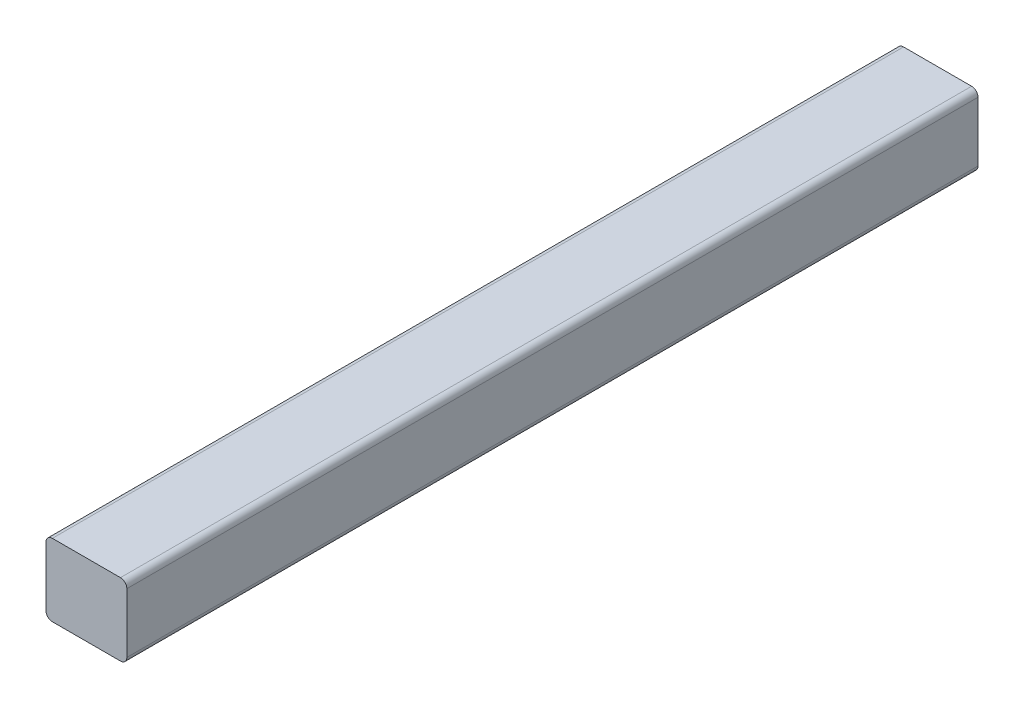
ISO-10303-21;
HEADER;
FILE_DESCRIPTION(('STEP AP214'),'2;1');
FILE_NAME('part.step','',(''),(''),'','','');
FILE_SCHEMA(('AUTOMOTIVE_DESIGN { 1 0 10303 214 1 1 1 1 }'));
ENDSEC;
DATA;
#1=APPLICATION_CONTEXT('core data for automotive mechanical design processes');
#2=APPLICATION_PROTOCOL_DEFINITION('international standard','automotive_design',2000,#1);
#3=PRODUCT_CONTEXT('',#1,'mechanical');
#4=PRODUCT('Part','Part','',(#3));
#5=PRODUCT_RELATED_PRODUCT_CATEGORY('part','',(#4));
#6=PRODUCT_DEFINITION_FORMATION('','',#4);
#7=PRODUCT_DEFINITION_CONTEXT('part definition',#1,'design');
#8=PRODUCT_DEFINITION('design','',#6,#7);
#9=PRODUCT_DEFINITION_SHAPE('','',#8);
#10=(LENGTH_UNIT() NAMED_UNIT(*) SI_UNIT(.MILLI.,.METRE.));
#11=(NAMED_UNIT(*) PLANE_ANGLE_UNIT() SI_UNIT($,.RADIAN.));
#12=(NAMED_UNIT(*) SI_UNIT($,.STERADIAN.) SOLID_ANGLE_UNIT());
#13=UNCERTAINTY_MEASURE_WITH_UNIT(LENGTH_MEASURE(1.E-05),#10,'distance_accuracy_value','');
#14=(GEOMETRIC_REPRESENTATION_CONTEXT(3) GLOBAL_UNCERTAINTY_ASSIGNED_CONTEXT((#13)) GLOBAL_UNIT_ASSIGNED_CONTEXT((#10,
#11,#12)) REPRESENTATION_CONTEXT('',''));
#15=CARTESIAN_POINT('',(0.,0.,0.));
#16=DIRECTION('',(0.,0.,1.));
#17=DIRECTION('',(1.,0.,0.));
#18=AXIS2_PLACEMENT_3D('',#15,#16,#17);
#19=CARTESIAN_POINT('',(-3.99999999999997,27.9897948556636,100.));
#20=DIRECTION('',(0.,0.,-1.));
#21=DIRECTION('',(-1.,0.,0.));
#22=AXIS2_PLACEMENT_3D('',#19,#20,#21);
#23=CYLINDRICAL_SURFACE('',#22,0.750000000000013);
#24=CARTESIAN_POINT('',(-3.99999999999997,27.9897948556636,0.));
#25=DIRECTION('',(0.,0.,1.));
#26=DIRECTION('',(1.,0.,0.));
#27=AXIS2_PLACEMENT_3D('',#24,#25,#26);
#28=CIRCLE('',#27,0.750000000000013);
#29=CARTESIAN_POINT('',(-4.74999999999999,27.9897948556636,0.));
#30=VERTEX_POINT('',#29);
#31=CARTESIAN_POINT('',(-3.99999999999994,28.7397948556636,0.));
#32=VERTEX_POINT('',#31);
#33=EDGE_CURVE('E133',#30,#32,#28,.F.);
#34=ORIENTED_EDGE('',*,*,#33,.F.);
#35=DIRECTION('',(0.,0.,-1.));
#36=VECTOR('',#35,1.);
#37=CARTESIAN_POINT('',(-4.74999999999999,27.9897948556636,100.));
#38=LINE('',#37,#36);
#39=CARTESIAN_POINT('',(-4.74999999999999,27.9897948556636,100.));
#40=VERTEX_POINT('',#39);
#41=EDGE_CURVE('E11',#40,#30,#38,.T.);
#42=ORIENTED_EDGE('',*,*,#41,.F.);
#43=CARTESIAN_POINT('',(-3.99999999999997,27.9897948556636,100.));
#44=DIRECTION('',(0.,0.,1.));
#45=DIRECTION('',(1.,0.,0.));
#46=AXIS2_PLACEMENT_3D('',#43,#44,#45);
#47=CIRCLE('',#46,0.750000000000013);
#48=CARTESIAN_POINT('',(-3.99999999999994,28.7397948556636,100.));
#49=VERTEX_POINT('',#48);
#50=EDGE_CURVE('E152',#40,#49,#47,.F.);
#51=ORIENTED_EDGE('',*,*,#50,.T.);
#52=DIRECTION('',(0.,0.,-1.));
#53=VECTOR('',#52,1.);
#54=CARTESIAN_POINT('',(-3.99999999999994,28.7397948556636,100.));
#55=LINE('',#54,#53);
#56=EDGE_CURVE('E55',#49,#32,#55,.T.);
#57=ORIENTED_EDGE('',*,*,#56,.T.);
#58=EDGE_LOOP('',(#34,#42,#51,#57));
#59=FACE_BOUND('',#58,.T.);
#60=ADVANCED_FACE('F39',(#59),#23,.T.);
#61=CARTESIAN_POINT('',(-4.75000000000004,0.,100.));
#62=DIRECTION('',(-1.,0.,0.));
#63=DIRECTION('',(0.,-1.,0.));
#64=AXIS2_PLACEMENT_3D('',#61,#62,#63);
#65=PLANE('',#64);
#66=DIRECTION('',(0.,1.,0.));
#67=VECTOR('',#66,1.);
#68=CARTESIAN_POINT('',(-4.75000000000004,0.,0.));
#69=LINE('',#68,#67);
#70=CARTESIAN_POINT('',(-4.75,21.,0.));
#71=VERTEX_POINT('',#70);
#72=EDGE_CURVE('E135',#71,#30,#69,.T.);
#73=ORIENTED_EDGE('',*,*,#72,.F.);
#74=DIRECTION('',(0.,0.,-1.));
#75=VECTOR('',#74,1.);
#76=CARTESIAN_POINT('',(-4.75,21.,100.));
#77=LINE('',#76,#75);
#78=CARTESIAN_POINT('',(-4.75,21.,100.));
#79=VERTEX_POINT('',#78);
#80=EDGE_CURVE('E47',#79,#71,#77,.T.);
#81=ORIENTED_EDGE('',*,*,#80,.F.);
#82=DIRECTION('',(0.,1.,0.));
#83=VECTOR('',#82,1.);
#84=CARTESIAN_POINT('',(-4.75000000000004,0.,100.));
#85=LINE('',#84,#83);
#86=EDGE_CURVE('E174',#79,#40,#85,.T.);
#87=ORIENTED_EDGE('',*,*,#86,.T.);
#88=ORIENTED_EDGE('',*,*,#41,.T.);
#89=EDGE_LOOP('',(#73,#81,#87,#88));
#90=FACE_BOUND('',#89,.T.);
#91=ADVANCED_FACE('F173',(#90),#65,.T.);
#92=CARTESIAN_POINT('',(-3.99999999999999,21.,100.));
#93=DIRECTION('',(0.,0.,-1.));
#94=DIRECTION('',(-1.,0.,0.));
#95=AXIS2_PLACEMENT_3D('',#92,#93,#94);
#96=CYLINDRICAL_SURFACE('',#95,0.750000000000013);
#97=CARTESIAN_POINT('',(-3.99999999999999,21.,0.));
#98=DIRECTION('',(0.,0.,1.));
#99=DIRECTION('',(1.,0.,0.));
#100=AXIS2_PLACEMENT_3D('',#97,#98,#99);
#101=CIRCLE('',#100,0.750000000000013);
#102=CARTESIAN_POINT('',(-3.99999999999996,20.25,0.));
#103=VERTEX_POINT('',#102);
#104=EDGE_CURVE('E138',#71,#103,#101,.T.);
#105=ORIENTED_EDGE('',*,*,#104,.T.);
#106=DIRECTION('',(0.,0.,-1.));
#107=VECTOR('',#106,1.);
#108=CARTESIAN_POINT('',(-3.99999999999996,20.25,100.));
#109=LINE('',#108,#107);
#110=CARTESIAN_POINT('',(-3.99999999999996,20.25,100.));
#111=VERTEX_POINT('',#110);
#112=EDGE_CURVE('E158',#111,#103,#109,.T.);
#113=ORIENTED_EDGE('',*,*,#112,.F.);
#114=CARTESIAN_POINT('',(-3.99999999999999,21.,100.));
#115=DIRECTION('',(0.,0.,1.));
#116=DIRECTION('',(1.,0.,0.));
#117=AXIS2_PLACEMENT_3D('',#114,#115,#116);
#118=CIRCLE('',#117,0.750000000000013);
#119=EDGE_CURVE('E164',#79,#111,#118,.T.);
#120=ORIENTED_EDGE('',*,*,#119,.F.);
#121=ORIENTED_EDGE('',*,*,#80,.T.);
#122=EDGE_LOOP('',(#105,#113,#120,#121));
#123=FACE_BOUND('',#122,.T.);
#124=ADVANCED_FACE('F162',(#123),#96,.T.);
#125=CARTESIAN_POINT('',(1.59833084267812E-12,20.2499999999997,100.));
#126=DIRECTION('',(0.,-1.,0.));
#127=DIRECTION('',(1.,0.,0.));
#128=AXIS2_PLACEMENT_3D('',#125,#126,#127);
#129=PLANE('',#128);
#130=DIRECTION('',(-1.,0.,0.));
#131=VECTOR('',#130,1.);
#132=CARTESIAN_POINT('',(1.59833084267812E-12,20.2499999999997,0.));
#133=LINE('',#132,#131);
#134=CARTESIAN_POINT('',(4.00000000000001,20.25,0.));
#135=VERTEX_POINT('',#134);
#136=EDGE_CURVE('E141',#135,#103,#133,.T.);
#137=ORIENTED_EDGE('',*,*,#136,.F.);
#138=DIRECTION('',(0.,0.,-1.));
#139=VECTOR('',#138,1.);
#140=CARTESIAN_POINT('',(4.00000000000001,20.25,100.));
#141=LINE('',#140,#139);
#142=CARTESIAN_POINT('',(4.00000000000001,20.25,100.));
#143=VERTEX_POINT('',#142);
#144=EDGE_CURVE('E156',#143,#135,#141,.T.);
#145=ORIENTED_EDGE('',*,*,#144,.F.);
#146=DIRECTION('',(-1.,0.,0.));
#147=VECTOR('',#146,1.);
#148=CARTESIAN_POINT('',(1.59833084267812E-12,20.2499999999997,100.));
#149=LINE('',#148,#147);
#150=EDGE_CURVE('E265',#143,#111,#149,.T.);
#151=ORIENTED_EDGE('',*,*,#150,.T.);
#152=ORIENTED_EDGE('',*,*,#112,.T.);
#153=EDGE_LOOP('',(#137,#145,#151,#152));
#154=FACE_BOUND('',#153,.T.);
#155=ADVANCED_FACE('F192',(#154),#129,.T.);
#156=CARTESIAN_POINT('',(4.00000000000001,21.,100.));
#157=DIRECTION('',(0.,0.,-1.));
#158=DIRECTION('',(-1.,0.,0.));
#159=AXIS2_PLACEMENT_3D('',#156,#157,#158);
#160=CYLINDRICAL_SURFACE('',#159,0.750000000000015);
#161=CARTESIAN_POINT('',(4.00000000000001,21.,0.));
#162=DIRECTION('',(0.,0.,1.));
#163=DIRECTION('',(1.,0.,0.));
#164=AXIS2_PLACEMENT_3D('',#161,#162,#163);
#165=CIRCLE('',#164,0.750000000000015);
#166=CARTESIAN_POINT('',(4.75000000000004,21.,0.));
#167=VERTEX_POINT('',#166);
#168=EDGE_CURVE('E144',#135,#167,#165,.T.);
#169=ORIENTED_EDGE('',*,*,#168,.T.);
#170=DIRECTION('',(0.,0.,-1.));
#171=VECTOR('',#170,1.);
#172=CARTESIAN_POINT('',(4.75000000000004,21.,100.));
#173=LINE('',#172,#171);
#174=CARTESIAN_POINT('',(4.75000000000004,21.,100.));
#175=VERTEX_POINT('',#174);
#176=EDGE_CURVE('E125',#175,#167,#173,.T.);
#177=ORIENTED_EDGE('',*,*,#176,.F.);
#178=CARTESIAN_POINT('',(4.00000000000001,21.,100.));
#179=DIRECTION('',(0.,0.,1.));
#180=DIRECTION('',(1.,0.,0.));
#181=AXIS2_PLACEMENT_3D('',#178,#179,#180);
#182=CIRCLE('',#181,0.750000000000015);
#183=EDGE_CURVE('E113',#143,#175,#182,.T.);
#184=ORIENTED_EDGE('',*,*,#183,.F.);
#185=ORIENTED_EDGE('',*,*,#144,.T.);
#186=EDGE_LOOP('',(#169,#177,#184,#185));
#187=FACE_BOUND('',#186,.T.);
#188=ADVANCED_FACE('F197',(#187),#160,.T.);
#189=CARTESIAN_POINT('',(4.75,0.,100.));
#190=DIRECTION('',(-1.,0.,0.));
#191=DIRECTION('',(0.,-1.,0.));
#192=AXIS2_PLACEMENT_3D('',#189,#190,#191);
#193=PLANE('',#192);
#194=DIRECTION('',(0.,1.,0.));
#195=VECTOR('',#194,1.);
#196=CARTESIAN_POINT('',(4.75,0.,0.));
#197=LINE('',#196,#195);
#198=CARTESIAN_POINT('',(4.75000000000006,27.9897948556636,0.));
#199=VERTEX_POINT('',#198);
#200=EDGE_CURVE('E122',#167,#199,#197,.T.);
#201=ORIENTED_EDGE('',*,*,#200,.T.);
#202=DIRECTION('',(0.,0.,-1.));
#203=VECTOR('',#202,1.);
#204=CARTESIAN_POINT('',(4.75000000000006,27.9897948556636,100.));
#205=LINE('',#204,#203);
#206=CARTESIAN_POINT('',(4.75000000000006,27.9897948556636,100.));
#207=VERTEX_POINT('',#206);
#208=EDGE_CURVE('E119',#207,#199,#205,.T.);
#209=ORIENTED_EDGE('',*,*,#208,.F.);
#210=DIRECTION('',(0.,1.,0.));
#211=VECTOR('',#210,1.);
#212=CARTESIAN_POINT('',(4.75,0.,100.));
#213=LINE('',#212,#211);
#214=EDGE_CURVE('E105',#175,#207,#213,.T.);
#215=ORIENTED_EDGE('',*,*,#214,.F.);
#216=ORIENTED_EDGE('',*,*,#176,.T.);
#217=EDGE_LOOP('',(#201,#209,#215,#216));
#218=FACE_BOUND('',#217,.T.);
#219=ADVANCED_FACE('F120',(#218),#193,.F.);
#220=CARTESIAN_POINT('',(4.00000000000003,27.9897948556636,100.));
#221=DIRECTION('',(0.,0.,-1.));
#222=DIRECTION('',(-1.,0.,0.));
#223=AXIS2_PLACEMENT_3D('',#220,#221,#222);
#224=CYLINDRICAL_SURFACE('',#223,0.750000000000015);
#225=CARTESIAN_POINT('',(4.00000000000003,27.9897948556636,0.));
#226=DIRECTION('',(0.,0.,1.));
#227=DIRECTION('',(1.,0.,0.));
#228=AXIS2_PLACEMENT_3D('',#225,#226,#227);
#229=CIRCLE('',#228,0.750000000000015);
#230=CARTESIAN_POINT('',(4.00000000000002,28.7397948556636,0.));
#231=VERTEX_POINT('',#230);
#232=EDGE_CURVE('E147',#231,#199,#229,.F.);
#233=ORIENTED_EDGE('',*,*,#232,.F.);
#234=DIRECTION('',(0.,0.,-1.));
#235=VECTOR('',#234,1.);
#236=CARTESIAN_POINT('',(4.00000000000002,28.7397948556636,100.));
#237=LINE('',#236,#235);
#238=CARTESIAN_POINT('',(4.00000000000002,28.7397948556636,100.));
#239=VERTEX_POINT('',#238);
#240=EDGE_CURVE('E80',#239,#231,#237,.T.);
#241=ORIENTED_EDGE('',*,*,#240,.F.);
#242=CARTESIAN_POINT('',(4.00000000000003,27.9897948556636,100.));
#243=DIRECTION('',(0.,0.,1.));
#244=DIRECTION('',(1.,0.,0.));
#245=AXIS2_PLACEMENT_3D('',#242,#243,#244);
#246=CIRCLE('',#245,0.750000000000015);
#247=EDGE_CURVE('E110',#239,#207,#246,.F.);
#248=ORIENTED_EDGE('',*,*,#247,.T.);
#249=ORIENTED_EDGE('',*,*,#208,.T.);
#250=EDGE_LOOP('',(#233,#241,#248,#249));
#251=FACE_BOUND('',#250,.T.);
#252=ADVANCED_FACE('F127',(#251),#224,.T.);
#253=CARTESIAN_POINT('',(2.24350185738949E-12,28.7397948556639,100.));
#254=DIRECTION('',(0.,1.,0.));
#255=DIRECTION('',(-1.,0.,0.));
#256=AXIS2_PLACEMENT_3D('',#253,#254,#255);
#257=PLANE('',#256);
#258=DIRECTION('',(1.,0.,0.));
#259=VECTOR('',#258,1.);
#260=CARTESIAN_POINT('',(2.24350185738949E-12,28.7397948556639,0.));
#261=LINE('',#260,#259);
#262=EDGE_CURVE('E149',#32,#231,#261,.T.);
#263=ORIENTED_EDGE('',*,*,#262,.F.);
#264=ORIENTED_EDGE('',*,*,#56,.F.);
#265=DIRECTION('',(1.,0.,0.));
#266=VECTOR('',#265,1.);
#267=CARTESIAN_POINT('',(2.24350185738949E-12,28.7397948556639,100.));
#268=LINE('',#267,#266);
#269=EDGE_CURVE('E128',#49,#239,#268,.T.);
#270=ORIENTED_EDGE('',*,*,#269,.T.);
#271=ORIENTED_EDGE('',*,*,#240,.T.);
#272=EDGE_LOOP('',(#263,#264,#270,#271));
#273=FACE_BOUND('',#272,.T.);
#274=ADVANCED_FACE('F175',(#273),#257,.T.);
#275=CARTESIAN_POINT('',(0.,0.,100.));
#276=DIRECTION('',(0.,0.,1.));
#277=DIRECTION('',(1.,0.,0.));
#278=AXIS2_PLACEMENT_3D('',#275,#276,#277);
#279=PLANE('',#278);
#280=ORIENTED_EDGE('',*,*,#50,.F.);
#281=ORIENTED_EDGE('',*,*,#86,.F.);
#282=ORIENTED_EDGE('',*,*,#119,.T.);
#283=ORIENTED_EDGE('',*,*,#150,.F.);
#284=ORIENTED_EDGE('',*,*,#183,.T.);
#285=ORIENTED_EDGE('',*,*,#214,.T.);
#286=ORIENTED_EDGE('',*,*,#247,.F.);
#287=ORIENTED_EDGE('',*,*,#269,.F.);
#288=EDGE_LOOP('',(#280,#281,#282,#283,#284,#285,#286,#287));
#289=FACE_BOUND('',#288,.T.);
#290=ADVANCED_FACE('F107',(#289),#279,.T.);
#291=CARTESIAN_POINT('',(0.,0.,0.));
#292=DIRECTION('',(0.,0.,1.));
#293=DIRECTION('',(1.,0.,0.));
#294=AXIS2_PLACEMENT_3D('',#291,#292,#293);
#295=PLANE('',#294);
#296=ORIENTED_EDGE('',*,*,#33,.T.);
#297=ORIENTED_EDGE('',*,*,#262,.T.);
#298=ORIENTED_EDGE('',*,*,#232,.T.);
#299=ORIENTED_EDGE('',*,*,#200,.F.);
#300=ORIENTED_EDGE('',*,*,#168,.F.);
#301=ORIENTED_EDGE('',*,*,#136,.T.);
#302=ORIENTED_EDGE('',*,*,#104,.F.);
#303=ORIENTED_EDGE('',*,*,#72,.T.);
#304=EDGE_LOOP('',(#296,#297,#298,#299,#300,#301,#302,#303));
#305=FACE_BOUND('',#304,.T.);
#306=ADVANCED_FACE('F170',(#305),#295,.F.);
#307=CLOSED_SHELL('',(#60,#91,#124,#155,#188,#219,#252,#274,#290,#306));
#308=MANIFOLD_SOLID_BREP('B2',#307);
#309=ADVANCED_BREP_SHAPE_REPRESENTATION('',(#18,#308),#14);
#310=SHAPE_DEFINITION_REPRESENTATION(#9,#309);
ENDSEC;
END-ISO-10303-21;
